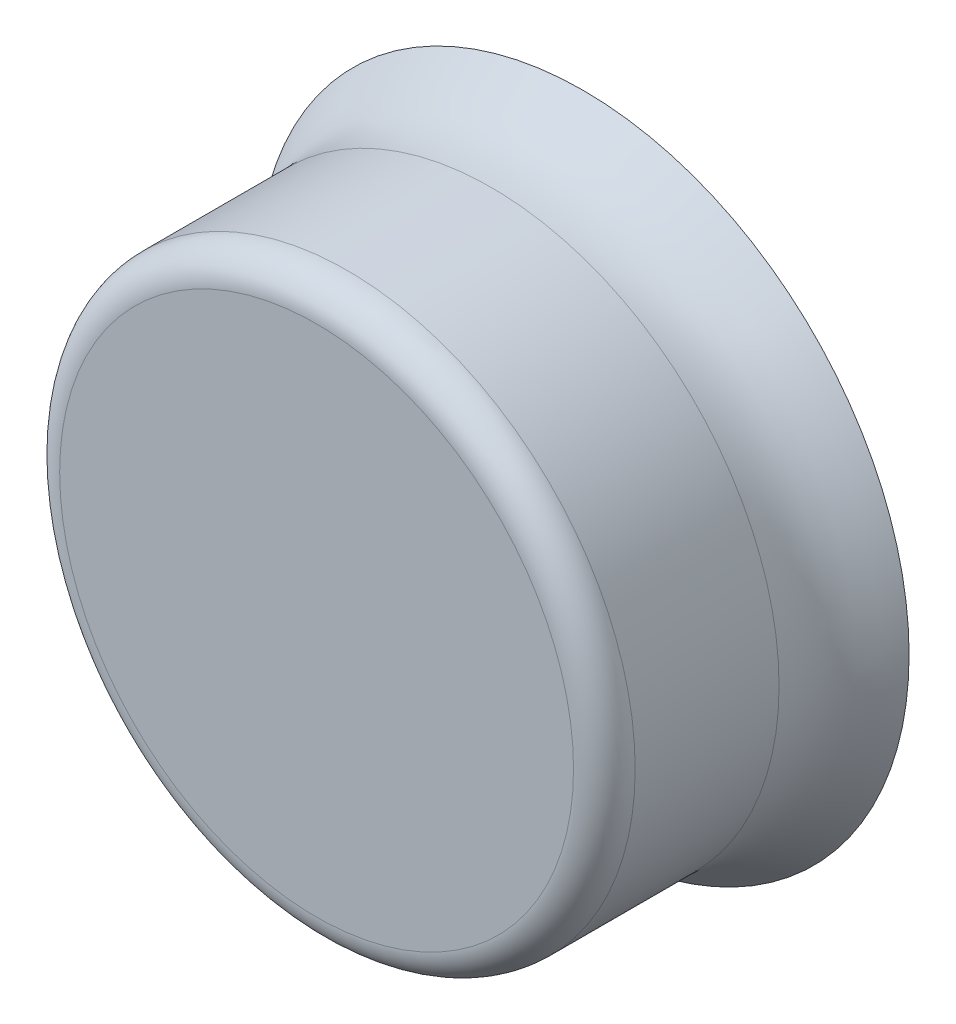
ISO-10303-21;
HEADER;
FILE_DESCRIPTION(('STEP AP214'),'2;1');
FILE_NAME('part.step','',(''),(''),'','','');
FILE_SCHEMA(('AUTOMOTIVE_DESIGN { 1 0 10303 214 1 1 1 1 }'));
ENDSEC;
DATA;
#1=APPLICATION_CONTEXT('core data for automotive mechanical design processes');
#2=APPLICATION_PROTOCOL_DEFINITION('international standard','automotive_design',2000,#1);
#3=PRODUCT_CONTEXT('',#1,'mechanical');
#4=PRODUCT('Part','Part','',(#3));
#5=PRODUCT_RELATED_PRODUCT_CATEGORY('part','',(#4));
#6=PRODUCT_DEFINITION_FORMATION('','',#4);
#7=PRODUCT_DEFINITION_CONTEXT('part definition',#1,'design');
#8=PRODUCT_DEFINITION('design','',#6,#7);
#9=PRODUCT_DEFINITION_SHAPE('','',#8);
#10=(LENGTH_UNIT() NAMED_UNIT(*) SI_UNIT(.MILLI.,.METRE.));
#11=(NAMED_UNIT(*) PLANE_ANGLE_UNIT() SI_UNIT($,.RADIAN.));
#12=(NAMED_UNIT(*) SI_UNIT($,.STERADIAN.) SOLID_ANGLE_UNIT());
#13=UNCERTAINTY_MEASURE_WITH_UNIT(LENGTH_MEASURE(1.E-05),#10,'distance_accuracy_value','');
#14=(GEOMETRIC_REPRESENTATION_CONTEXT(3) GLOBAL_UNCERTAINTY_ASSIGNED_CONTEXT((#13)) GLOBAL_UNIT_ASSIGNED_CONTEXT((#10,
#11,#12)) REPRESENTATION_CONTEXT('',''));
#15=CARTESIAN_POINT('',(0.,0.,0.));
#16=DIRECTION('',(0.,0.,1.));
#17=DIRECTION('',(1.,0.,0.));
#18=AXIS2_PLACEMENT_3D('',#15,#16,#17);
#19=CARTESIAN_POINT('',(28.,0.,-15.));
#20=CARTESIAN_POINT('',(28.,0.,-15.5919444997538));
#21=CARTESIAN_POINT('',(28.0257729774776,0.,-16.1137115744585));
#22=CARTESIAN_POINT('',(28.118412578145,0.,-17.0425471091535));
#23=CARTESIAN_POINT('',(28.1850918745369,0.,-17.4494962559552));
#24=CARTESIAN_POINT('',(28.3504048483728,0.,-18.1825524074839));
#25=CARTESIAN_POINT('',(28.4488511864012,0.,-18.5088749438393));
#26=CARTESIAN_POINT('',(28.676610927396,0.,-19.1227154789709));
#27=CARTESIAN_POINT('',(28.8061441811804,0.,-19.4106511928209));
#28=CARTESIAN_POINT('',(29.1038319683919,0.,-19.9870595900012));
#29=CARTESIAN_POINT('',(29.2723613879631,0.,-20.2755717298931));
#30=CARTESIAN_POINT('',(29.6539429222613,0.,-20.8811272278767));
#31=CARTESIAN_POINT('',(29.8670463385563,0.,-21.1979707122953));
#32=CARTESIAN_POINT('',(30.5677525768073,0.,-22.2216354518317));
#33=CARTESIAN_POINT('',(31.1172919182189,0.,-23.0014200835569));
#34=CARTESIAN_POINT('',(31.7023778581267,0.,-23.9502811670929));
#35=B_SPLINE_CURVE_WITH_KNOTS('',3,(#19,#20,#21,#22,#23,#24,#25,#26,#27,#28,#29,#30,#31,#32,#33,
#34),.UNSPECIFIED.,.F.,.F.,(4,2,2,2,2,2,2,4),(0.,0.125,0.25,0.375,0.5,0.625,0.75,1.),.UNSPECIFIED.);
#36=CARTESIAN_POINT('',(0.,0.,0.));
#37=DIRECTION('',(0.,0.,1.));
#38=AXIS1_PLACEMENT('',#36,#37);
#39=SURFACE_OF_REVOLUTION('',#35,#38);
#40=CARTESIAN_POINT('',(0.,0.,-23.9502811670929));
#41=DIRECTION('',(0.,0.,1.));
#42=DIRECTION('',(1.,0.,0.));
#43=AXIS2_PLACEMENT_3D('',#40,#41,#42);
#44=CIRCLE('',#43,31.7023778581267);
#45=CARTESIAN_POINT('',(31.7023778581267,0.,-23.9502811670929));
#46=VERTEX_POINT('',#45);
#47=EDGE_CURVE('E10',#46,#46,#44,.T.);
#48=ORIENTED_EDGE('',*,*,#47,.T.);
#49=EDGE_LOOP('',(#48));
#50=FACE_BOUND('',#49,.T.);
#51=CARTESIAN_POINT('',(0.,0.,-15.));
#52=DIRECTION('',(0.,0.,1.));
#53=DIRECTION('',(1.,0.,0.));
#54=AXIS2_PLACEMENT_3D('',#51,#52,#53);
#55=CIRCLE('',#54,28.);
#56=CARTESIAN_POINT('',(28.,0.,-15.));
#57=VERTEX_POINT('',#56);
#58=EDGE_CURVE('E68',#57,#57,#55,.T.);
#59=ORIENTED_EDGE('',*,*,#58,.F.);
#60=EDGE_LOOP('',(#59));
#61=FACE_BOUND('',#60,.T.);
#62=ADVANCED_FACE('F39',(#50,#61),#39,.F.);
#63=CARTESIAN_POINT('',(0.,0.,-25.));
#64=DIRECTION('',(0.,0.,1.));
#65=DIRECTION('',(1.,0.,0.));
#66=AXIS2_PLACEMENT_3D('',#63,#64,#65);
#67=CONICAL_SURFACE('',#66,30.,1.0182463834996);
#68=ORIENTED_EDGE('',*,*,#47,.F.);
#69=EDGE_LOOP('',(#68));
#70=FACE_BOUND('',#69,.T.);
#71=CARTESIAN_POINT('',(0.,0.,-25.));
#72=DIRECTION('',(0.,0.,1.));
#73=DIRECTION('',(1.,0.,0.));
#74=AXIS2_PLACEMENT_3D('',#71,#72,#73);
#75=CIRCLE('',#74,30.);
#76=CARTESIAN_POINT('',(30.,0.,-25.));
#77=VERTEX_POINT('',#76);
#78=EDGE_CURVE('E46',#77,#77,#75,.T.);
#79=ORIENTED_EDGE('',*,*,#78,.T.);
#80=EDGE_LOOP('',(#79));
#81=FACE_BOUND('',#80,.T.);
#82=ADVANCED_FACE('F81',(#70,#81),#67,.T.);
#83=CARTESIAN_POINT('',(26.,0.,-15.));
#84=CARTESIAN_POINT('',(26.,0.,-20.1992039814307));
#85=CARTESIAN_POINT('',(27.8079503309575,0.,-21.4450510903408));
#86=CARTESIAN_POINT('',(30.,0.,-25.));
#87=B_SPLINE_CURVE_WITH_KNOTS('',3,(#83,#84,#85,#86),.UNSPECIFIED.,.F.,.F.,(4,4),(0.,1.),.UNSPECIFIED.);
#88=CARTESIAN_POINT('',(0.,0.,0.));
#89=DIRECTION('',(0.,0.,1.));
#90=AXIS1_PLACEMENT('',#88,#89);
#91=SURFACE_OF_REVOLUTION('',#87,#90);
#92=ORIENTED_EDGE('',*,*,#78,.F.);
#93=EDGE_LOOP('',(#92));
#94=FACE_BOUND('',#93,.T.);
#95=CARTESIAN_POINT('',(0.,0.,-15.));
#96=DIRECTION('',(0.,0.,1.));
#97=DIRECTION('',(1.,0.,0.));
#98=AXIS2_PLACEMENT_3D('',#95,#96,#97);
#99=CIRCLE('',#98,26.);
#100=CARTESIAN_POINT('',(26.,0.,-15.));
#101=VERTEX_POINT('',#100);
#102=EDGE_CURVE('E49',#101,#101,#99,.T.);
#103=ORIENTED_EDGE('',*,*,#102,.T.);
#104=EDGE_LOOP('',(#103));
#105=FACE_BOUND('',#104,.T.);
#106=ADVANCED_FACE('F82',(#94,#105),#91,.T.);
#107=CARTESIAN_POINT('',(0.,0.,0.));
#108=DIRECTION('',(0.,0.,1.));
#109=DIRECTION('',(1.,0.,0.));
#110=AXIS2_PLACEMENT_3D('',#107,#108,#109);
#111=CYLINDRICAL_SURFACE('',#110,26.);
#112=ORIENTED_EDGE('',*,*,#102,.F.);
#113=EDGE_LOOP('',(#112));
#114=FACE_BOUND('',#113,.T.);
#115=CARTESIAN_POINT('',(0.,0.,-1.));
#116=DIRECTION('',(0.,0.,1.));
#117=DIRECTION('',(1.,0.,0.));
#118=AXIS2_PLACEMENT_3D('',#115,#116,#117);
#119=CIRCLE('',#118,26.);
#120=CARTESIAN_POINT('',(26.,0.,-1.));
#121=VERTEX_POINT('',#120);
#122=EDGE_CURVE('E53',#121,#121,#119,.T.);
#123=ORIENTED_EDGE('',*,*,#122,.T.);
#124=EDGE_LOOP('',(#123));
#125=FACE_BOUND('',#124,.T.);
#126=ADVANCED_FACE('F84',(#114,#125),#111,.F.);
#127=CARTESIAN_POINT('',(0.,0.,-0.999999999999997));
#128=DIRECTION('',(0.,0.,1.));
#129=DIRECTION('',(1.,0.,0.));
#130=AXIS2_PLACEMENT_3D('',#127,#128,#129);
#131=TOROIDAL_SURFACE('',#130,25.,1.);
#132=ORIENTED_EDGE('',*,*,#122,.F.);
#133=EDGE_LOOP('',(#132));
#134=FACE_BOUND('',#133,.T.);
#135=CARTESIAN_POINT('',(0.,0.,0.));
#136=DIRECTION('',(0.,0.,1.));
#137=DIRECTION('',(1.,0.,0.));
#138=AXIS2_PLACEMENT_3D('',#135,#136,#137);
#139=CIRCLE('',#138,25.);
#140=CARTESIAN_POINT('',(25.,0.,0.));
#141=VERTEX_POINT('',#140);
#142=EDGE_CURVE('E56',#141,#141,#139,.T.);
#143=ORIENTED_EDGE('',*,*,#142,.T.);
#144=EDGE_LOOP('',(#143));
#145=FACE_BOUND('',#144,.T.);
#146=ADVANCED_FACE('F120',(#134,#145),#131,.F.);
#147=CARTESIAN_POINT('',(0.,0.,0.));
#148=DIRECTION('',(0.,0.,1.));
#149=DIRECTION('',(1.,0.,0.));
#150=AXIS2_PLACEMENT_3D('',#147,#148,#149);
#151=PLANE('',#150);
#152=ORIENTED_EDGE('',*,*,#142,.F.);
#153=EDGE_LOOP('',(#152));
#154=FACE_BOUND('',#153,.T.);
#155=ADVANCED_FACE('F115',(#154),#151,.F.);
#156=CARTESIAN_POINT('',(0.,0.,2.));
#157=DIRECTION('',(0.,0.,1.));
#158=DIRECTION('',(1.,0.,0.));
#159=AXIS2_PLACEMENT_3D('',#156,#157,#158);
#160=PLANE('',#159);
#161=CARTESIAN_POINT('',(0.,0.,2.));
#162=DIRECTION('',(0.,0.,1.));
#163=DIRECTION('',(1.,0.,0.));
#164=AXIS2_PLACEMENT_3D('',#161,#162,#163);
#165=CIRCLE('',#164,25.);
#166=CARTESIAN_POINT('',(25.,0.,2.));
#167=VERTEX_POINT('',#166);
#168=EDGE_CURVE('E65',#167,#167,#165,.T.);
#169=ORIENTED_EDGE('',*,*,#168,.T.);
#170=EDGE_LOOP('',(#169));
#171=FACE_BOUND('',#170,.T.);
#172=ADVANCED_FACE('F110',(#171),#160,.T.);
#173=CARTESIAN_POINT('',(0.,0.,-0.999999999999997));
#174=DIRECTION('',(0.,0.,1.));
#175=DIRECTION('',(1.,0.,0.));
#176=AXIS2_PLACEMENT_3D('',#173,#174,#175);
#177=TOROIDAL_SURFACE('',#176,25.,3.);
#178=CARTESIAN_POINT('',(0.,0.,-1.));
#179=DIRECTION('',(0.,0.,1.));
#180=DIRECTION('',(1.,0.,0.));
#181=AXIS2_PLACEMENT_3D('',#178,#179,#180);
#182=CIRCLE('',#181,28.);
#183=CARTESIAN_POINT('',(28.,0.,-1.));
#184=VERTEX_POINT('',#183);
#185=EDGE_CURVE('E64',#184,#184,#182,.T.);
#186=ORIENTED_EDGE('',*,*,#185,.T.);
#187=EDGE_LOOP('',(#186));
#188=FACE_BOUND('',#187,.T.);
#189=ORIENTED_EDGE('',*,*,#168,.F.);
#190=EDGE_LOOP('',(#189));
#191=FACE_BOUND('',#190,.T.);
#192=ADVANCED_FACE('F101',(#188,#191),#177,.T.);
#193=CARTESIAN_POINT('',(0.,0.,0.));
#194=DIRECTION('',(0.,0.,1.));
#195=DIRECTION('',(1.,0.,0.));
#196=AXIS2_PLACEMENT_3D('',#193,#194,#195);
#197=CYLINDRICAL_SURFACE('',#196,28.);
#198=ORIENTED_EDGE('',*,*,#58,.T.);
#199=EDGE_LOOP('',(#198));
#200=FACE_BOUND('',#199,.T.);
#201=ORIENTED_EDGE('',*,*,#185,.F.);
#202=EDGE_LOOP('',(#201));
#203=FACE_BOUND('',#202,.T.);
#204=ADVANCED_FACE('F98',(#200,#203),#197,.T.);
#205=CLOSED_SHELL('',(#62,#82,#106,#126,#146,#155,#172,#192,#204));
#206=MANIFOLD_SOLID_BREP('B2',#205);
#207=ADVANCED_BREP_SHAPE_REPRESENTATION('',(#18,#206),#14);
#208=SHAPE_DEFINITION_REPRESENTATION(#9,#207);
ENDSEC;
END-ISO-10303-21;
